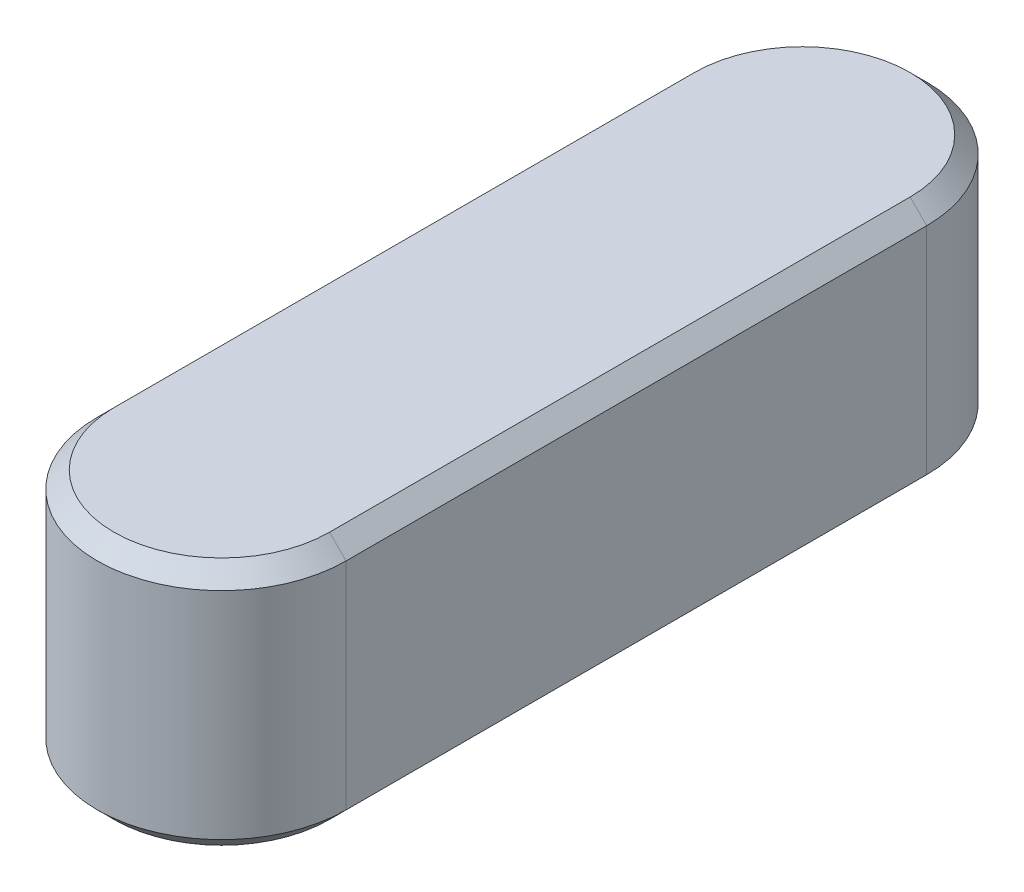
ISO-10303-21;
HEADER;
FILE_DESCRIPTION(('STEP AP214'),'2;1');
FILE_NAME('part.step','',(''),(''),'','','');
FILE_SCHEMA(('AUTOMOTIVE_DESIGN { 1 0 10303 214 1 1 1 1 }'));
ENDSEC;
DATA;
#1=APPLICATION_CONTEXT('core data for automotive mechanical design processes');
#2=APPLICATION_PROTOCOL_DEFINITION('international standard','automotive_design',2000,#1);
#3=PRODUCT_CONTEXT('',#1,'mechanical');
#4=PRODUCT('Part','Part','',(#3));
#5=PRODUCT_RELATED_PRODUCT_CATEGORY('part','',(#4));
#6=PRODUCT_DEFINITION_FORMATION('','',#4);
#7=PRODUCT_DEFINITION_CONTEXT('part definition',#1,'design');
#8=PRODUCT_DEFINITION('design','',#6,#7);
#9=PRODUCT_DEFINITION_SHAPE('','',#8);
#10=(LENGTH_UNIT() NAMED_UNIT(*) SI_UNIT(.MILLI.,.METRE.));
#11=(NAMED_UNIT(*) PLANE_ANGLE_UNIT() SI_UNIT($,.RADIAN.));
#12=(NAMED_UNIT(*) SI_UNIT($,.STERADIAN.) SOLID_ANGLE_UNIT());
#13=UNCERTAINTY_MEASURE_WITH_UNIT(LENGTH_MEASURE(1.E-05),#10,'distance_accuracy_value','');
#14=(GEOMETRIC_REPRESENTATION_CONTEXT(3) GLOBAL_UNCERTAINTY_ASSIGNED_CONTEXT((#13)) GLOBAL_UNIT_ASSIGNED_CONTEXT((#10,
#11,#12)) REPRESENTATION_CONTEXT('',''));
#15=CARTESIAN_POINT('',(0.,0.,0.));
#16=DIRECTION('',(0.,0.,1.));
#17=DIRECTION('',(1.,0.,0.));
#18=AXIS2_PLACEMENT_3D('',#15,#16,#17);
#19=CARTESIAN_POINT('',(-26.4948275862069,3.,-23.2833333333333));
#20=DIRECTION('',(0.,-1.,0.));
#21=DIRECTION('',(0.,0.,-1.));
#22=AXIS2_PLACEMENT_3D('',#19,#20,#21);
#23=CYLINDRICAL_SURFACE('',#22,1.5);
#24=DIRECTION('',(0.,-1.,0.));
#25=VECTOR('',#24,1.);
#26=CARTESIAN_POINT('',(-24.9948275862069,3.,-23.2833333333333));
#27=LINE('',#26,#25);
#28=CARTESIAN_POINT('',(-24.9948275862069,2.8,-23.2833333333333));
#29=VERTEX_POINT('',#28);
#30=CARTESIAN_POINT('',(-24.9948275862069,0.2,-23.2833333333333));
#31=VERTEX_POINT('',#30);
#32=EDGE_CURVE('E164',#29,#31,#27,.T.);
#33=ORIENTED_EDGE('',*,*,#32,.T.);
#34=CARTESIAN_POINT('',(-26.4948275862069,0.2,-23.2833333333333));
#35=DIRECTION('',(0.,1.,0.));
#36=DIRECTION('',(0.,0.,1.));
#37=AXIS2_PLACEMENT_3D('',#34,#35,#36);
#38=CIRCLE('',#37,1.5);
#39=CARTESIAN_POINT('',(-27.9948275862069,0.2,-23.2833333333333));
#40=VERTEX_POINT('',#39);
#41=EDGE_CURVE('E113',#31,#40,#38,.T.);
#42=ORIENTED_EDGE('',*,*,#41,.T.);
#43=DIRECTION('',(0.,-1.,0.));
#44=VECTOR('',#43,1.);
#45=CARTESIAN_POINT('',(-27.9948275862069,3.,-23.2833333333333));
#46=LINE('',#45,#44);
#47=CARTESIAN_POINT('',(-27.9948275862069,2.8,-23.2833333333333));
#48=VERTEX_POINT('',#47);
#49=EDGE_CURVE('E114',#48,#40,#46,.T.);
#50=ORIENTED_EDGE('',*,*,#49,.F.);
#51=CARTESIAN_POINT('',(-26.4948275862069,2.8,-23.2833333333333));
#52=DIRECTION('',(0.,1.,0.));
#53=DIRECTION('',(0.,0.,1.));
#54=AXIS2_PLACEMENT_3D('',#51,#52,#53);
#55=CIRCLE('',#54,1.5);
#56=EDGE_CURVE('E106',#48,#29,#55,.F.);
#57=ORIENTED_EDGE('',*,*,#56,.T.);
#58=EDGE_LOOP('',(#33,#42,#50,#57));
#59=FACE_BOUND('',#58,.T.);
#60=ADVANCED_FACE('F31',(#59),#23,.T.);
#61=CARTESIAN_POINT('',(-27.9948275862069,3.,-23.2833333333333));
#62=DIRECTION('',(1.,0.,0.));
#63=DIRECTION('',(0.,0.,-1.));
#64=AXIS2_PLACEMENT_3D('',#61,#62,#63);
#65=PLANE('',#64);
#66=ORIENTED_EDGE('',*,*,#49,.T.);
#67=DIRECTION('',(0.,0.,1.));
#68=VECTOR('',#67,1.);
#69=CARTESIAN_POINT('',(-27.9948275862069,0.2,-23.2833333333333));
#70=LINE('',#69,#68);
#71=CARTESIAN_POINT('',(-27.9948275862069,0.2,-16.2833333333333));
#72=VERTEX_POINT('',#71);
#73=EDGE_CURVE('E122',#40,#72,#70,.T.);
#74=ORIENTED_EDGE('',*,*,#73,.T.);
#75=DIRECTION('',(0.,-1.,0.));
#76=VECTOR('',#75,1.);
#77=CARTESIAN_POINT('',(-27.9948275862069,3.,-16.2833333333333));
#78=LINE('',#77,#76);
#79=CARTESIAN_POINT('',(-27.9948275862069,2.8,-16.2833333333333));
#80=VERTEX_POINT('',#79);
#81=EDGE_CURVE('E121',#80,#72,#78,.T.);
#82=ORIENTED_EDGE('',*,*,#81,.F.);
#83=DIRECTION('',(0.,0.,-1.));
#84=VECTOR('',#83,1.);
#85=CARTESIAN_POINT('',(-27.9948275862069,2.8,-23.2833333333333));
#86=LINE('',#85,#84);
#87=EDGE_CURVE('E101',#80,#48,#86,.T.);
#88=ORIENTED_EDGE('',*,*,#87,.T.);
#89=EDGE_LOOP('',(#66,#74,#82,#88));
#90=FACE_BOUND('',#89,.T.);
#91=ADVANCED_FACE('F119',(#90),#65,.F.);
#92=CARTESIAN_POINT('',(-26.4948275862069,3.,-16.2833333333333));
#93=DIRECTION('',(0.,-1.,0.));
#94=DIRECTION('',(0.,0.,-1.));
#95=AXIS2_PLACEMENT_3D('',#92,#93,#94);
#96=CYLINDRICAL_SURFACE('',#95,1.5);
#97=ORIENTED_EDGE('',*,*,#81,.T.);
#98=CARTESIAN_POINT('',(-26.4948275862069,0.2,-16.2833333333333));
#99=DIRECTION('',(0.,1.,0.));
#100=DIRECTION('',(0.,0.,1.));
#101=AXIS2_PLACEMENT_3D('',#98,#99,#100);
#102=CIRCLE('',#101,1.5);
#103=CARTESIAN_POINT('',(-24.9948275862069,0.2,-16.2833333333333));
#104=VERTEX_POINT('',#103);
#105=EDGE_CURVE('E148',#72,#104,#102,.T.);
#106=ORIENTED_EDGE('',*,*,#105,.T.);
#107=DIRECTION('',(0.,-1.,0.));
#108=VECTOR('',#107,1.);
#109=CARTESIAN_POINT('',(-24.9948275862069,3.,-16.2833333333333));
#110=LINE('',#109,#108);
#111=CARTESIAN_POINT('',(-24.9948275862069,2.8,-16.2833333333333));
#112=VERTEX_POINT('',#111);
#113=EDGE_CURVE('E128',#112,#104,#110,.T.);
#114=ORIENTED_EDGE('',*,*,#113,.F.);
#115=CARTESIAN_POINT('',(-26.4948275862069,2.8,-16.2833333333333));
#116=DIRECTION('',(0.,1.,0.));
#117=DIRECTION('',(0.,0.,1.));
#118=AXIS2_PLACEMENT_3D('',#115,#116,#117);
#119=CIRCLE('',#118,1.5);
#120=EDGE_CURVE('E146',#112,#80,#119,.F.);
#121=ORIENTED_EDGE('',*,*,#120,.T.);
#122=EDGE_LOOP('',(#97,#106,#114,#121));
#123=FACE_BOUND('',#122,.T.);
#124=ADVANCED_FACE('F185',(#123),#96,.T.);
#125=CARTESIAN_POINT('',(-24.9948275862069,3.,-23.2833333333333));
#126=DIRECTION('',(-1.,0.,0.));
#127=DIRECTION('',(0.,0.,1.));
#128=AXIS2_PLACEMENT_3D('',#125,#126,#127);
#129=PLANE('',#128);
#130=ORIENTED_EDGE('',*,*,#113,.T.);
#131=DIRECTION('',(0.,0.,-1.));
#132=VECTOR('',#131,1.);
#133=CARTESIAN_POINT('',(-24.9948275862069,0.2,-23.2833333333333));
#134=LINE('',#133,#132);
#135=EDGE_CURVE('E144',#104,#31,#134,.T.);
#136=ORIENTED_EDGE('',*,*,#135,.T.);
#137=ORIENTED_EDGE('',*,*,#32,.F.);
#138=DIRECTION('',(0.,0.,1.));
#139=VECTOR('',#138,1.);
#140=CARTESIAN_POINT('',(-24.9948275862069,2.8,-16.2833333333333));
#141=LINE('',#140,#139);
#142=EDGE_CURVE('E142',#29,#112,#141,.T.);
#143=ORIENTED_EDGE('',*,*,#142,.T.);
#144=EDGE_LOOP('',(#130,#136,#137,#143));
#145=FACE_BOUND('',#144,.T.);
#146=ADVANCED_FACE('F176',(#145),#129,.F.);
#147=CARTESIAN_POINT('',(-26.4948275862069,3.,-23.2833333333333));
#148=DIRECTION('',(0.,1.,0.));
#149=DIRECTION('',(0.,0.,1.));
#150=AXIS2_PLACEMENT_3D('',#147,#148,#149);
#151=PLANE('',#150);
#152=CARTESIAN_POINT('',(-26.4948275862069,3.,-23.2833333333333));
#153=DIRECTION('',(0.,1.,0.));
#154=DIRECTION('',(0.,0.,1.));
#155=AXIS2_PLACEMENT_3D('',#152,#153,#154);
#156=CIRCLE('',#155,1.3);
#157=CARTESIAN_POINT('',(-25.1948275862069,3.,-23.2833333333333));
#158=VERTEX_POINT('',#157);
#159=CARTESIAN_POINT('',(-27.7948275862069,3.,-23.2833333333333));
#160=VERTEX_POINT('',#159);
#161=EDGE_CURVE('E55',#158,#160,#156,.T.);
#162=ORIENTED_EDGE('',*,*,#161,.T.);
#163=DIRECTION('',(0.,0.,1.));
#164=VECTOR('',#163,1.);
#165=CARTESIAN_POINT('',(-27.7948275862069,3.,-16.2833333333333));
#166=LINE('',#165,#164);
#167=CARTESIAN_POINT('',(-27.7948275862069,3.,-16.2833333333333));
#168=VERTEX_POINT('',#167);
#169=EDGE_CURVE('E11',#160,#168,#166,.T.);
#170=ORIENTED_EDGE('',*,*,#169,.T.);
#171=CARTESIAN_POINT('',(-26.4948275862069,3.,-16.2833333333333));
#172=DIRECTION('',(0.,1.,0.));
#173=DIRECTION('',(0.,0.,1.));
#174=AXIS2_PLACEMENT_3D('',#171,#172,#173);
#175=CIRCLE('',#174,1.3);
#176=CARTESIAN_POINT('',(-25.1948275862069,3.,-16.2833333333333));
#177=VERTEX_POINT('',#176);
#178=EDGE_CURVE('E40',#168,#177,#175,.T.);
#179=ORIENTED_EDGE('',*,*,#178,.T.);
#180=DIRECTION('',(0.,0.,-1.));
#181=VECTOR('',#180,1.);
#182=CARTESIAN_POINT('',(-25.1948275862069,3.,-23.2833333333333));
#183=LINE('',#182,#181);
#184=EDGE_CURVE('E150',#177,#158,#183,.T.);
#185=ORIENTED_EDGE('',*,*,#184,.T.);
#186=EDGE_LOOP('',(#162,#170,#179,#185));
#187=FACE_BOUND('',#186,.T.);
#188=ADVANCED_FACE('F173',(#187),#151,.T.);
#189=CARTESIAN_POINT('',(-26.4948275862069,0.,-23.2833333333333));
#190=DIRECTION('',(0.,1.,0.));
#191=DIRECTION('',(0.,0.,1.));
#192=AXIS2_PLACEMENT_3D('',#189,#190,#191);
#193=PLANE('',#192);
#194=DIRECTION('',(0.,0.,-1.));
#195=VECTOR('',#194,1.);
#196=CARTESIAN_POINT('',(-27.7948275862069,0.,-23.2833333333333));
#197=LINE('',#196,#195);
#198=CARTESIAN_POINT('',(-27.7948275862069,0.,-16.2833333333333));
#199=VERTEX_POINT('',#198);
#200=CARTESIAN_POINT('',(-27.7948275862069,0.,-23.2833333333333));
#201=VERTEX_POINT('',#200);
#202=EDGE_CURVE('E137',#199,#201,#197,.T.);
#203=ORIENTED_EDGE('',*,*,#202,.T.);
#204=CARTESIAN_POINT('',(-26.4948275862069,0.,-23.2833333333333));
#205=DIRECTION('',(0.,1.,0.));
#206=DIRECTION('',(0.,0.,1.));
#207=AXIS2_PLACEMENT_3D('',#204,#205,#206);
#208=CIRCLE('',#207,1.3);
#209=CARTESIAN_POINT('',(-25.1948275862069,0.,-23.2833333333333));
#210=VERTEX_POINT('',#209);
#211=EDGE_CURVE('E123',#201,#210,#208,.F.);
#212=ORIENTED_EDGE('',*,*,#211,.T.);
#213=DIRECTION('',(0.,0.,1.));
#214=VECTOR('',#213,1.);
#215=CARTESIAN_POINT('',(-25.1948275862069,0.,-23.2833333333333));
#216=LINE('',#215,#214);
#217=CARTESIAN_POINT('',(-25.1948275862069,0.,-16.2833333333333));
#218=VERTEX_POINT('',#217);
#219=EDGE_CURVE('E135',#210,#218,#216,.T.);
#220=ORIENTED_EDGE('',*,*,#219,.T.);
#221=CARTESIAN_POINT('',(-26.4948275862069,0.,-16.2833333333333));
#222=DIRECTION('',(0.,1.,0.));
#223=DIRECTION('',(0.,0.,1.));
#224=AXIS2_PLACEMENT_3D('',#221,#222,#223);
#225=CIRCLE('',#224,1.3);
#226=EDGE_CURVE('E133',#218,#199,#225,.F.);
#227=ORIENTED_EDGE('',*,*,#226,.T.);
#228=EDGE_LOOP('',(#203,#212,#220,#227));
#229=FACE_BOUND('',#228,.T.);
#230=ADVANCED_FACE('F175',(#229),#193,.F.);
#231=CARTESIAN_POINT('',(-26.4948275862069,0.2,-16.2833333333333));
#232=DIRECTION('',(0.,1.,0.));
#233=DIRECTION('',(0.,0.,1.));
#234=AXIS2_PLACEMENT_3D('',#231,#232,#233);
#235=CONICAL_SURFACE('',#234,1.5,0.785398163397454);
#236=DIRECTION('',(-0.707106781186551,0.707106781186544,0.));
#237=VECTOR('',#236,1.);
#238=CARTESIAN_POINT('',(-27.7948275862069,0.,-16.2833333333333));
#239=LINE('',#238,#237);
#240=EDGE_CURVE('E158',#199,#72,#239,.T.);
#241=ORIENTED_EDGE('',*,*,#240,.F.);
#242=ORIENTED_EDGE('',*,*,#226,.F.);
#243=DIRECTION('',(-0.707106781186551,-0.707106781186544,0.));
#244=VECTOR('',#243,1.);
#245=CARTESIAN_POINT('',(-24.9948275862069,0.2,-16.2833333333333));
#246=LINE('',#245,#244);
#247=EDGE_CURVE('E161',#104,#218,#246,.T.);
#248=ORIENTED_EDGE('',*,*,#247,.F.);
#249=ORIENTED_EDGE('',*,*,#105,.F.);
#250=EDGE_LOOP('',(#241,#242,#248,#249));
#251=FACE_BOUND('',#250,.T.);
#252=ADVANCED_FACE('F182',(#251),#235,.T.);
#253=CARTESIAN_POINT('',(-24.9948275862069,0.2,-23.2833333333333));
#254=DIRECTION('',(-0.707106781186544,0.707106781186551,0.));
#255=DIRECTION('',(-0.707106781186551,-0.707106781186544,0.));
#256=AXIS2_PLACEMENT_3D('',#253,#254,#255);
#257=PLANE('',#256);
#258=ORIENTED_EDGE('',*,*,#247,.T.);
#259=ORIENTED_EDGE('',*,*,#219,.F.);
#260=DIRECTION('',(-0.707106781186551,-0.707106781186544,0.));
#261=VECTOR('',#260,1.);
#262=CARTESIAN_POINT('',(-24.9948275862069,0.2,-23.2833333333333));
#263=LINE('',#262,#261);
#264=EDGE_CURVE('E156',#31,#210,#263,.T.);
#265=ORIENTED_EDGE('',*,*,#264,.F.);
#266=ORIENTED_EDGE('',*,*,#135,.F.);
#267=EDGE_LOOP('',(#258,#259,#265,#266));
#268=FACE_BOUND('',#267,.T.);
#269=ADVANCED_FACE('F203',(#268),#257,.F.);
#270=CARTESIAN_POINT('',(-27.9948275862069,0.2,-23.2833333333333));
#271=DIRECTION('',(0.707106781186544,0.707106781186551,0.));
#272=DIRECTION('',(-0.707106781186551,0.707106781186544,0.));
#273=AXIS2_PLACEMENT_3D('',#270,#271,#272);
#274=PLANE('',#273);
#275=ORIENTED_EDGE('',*,*,#240,.T.);
#276=ORIENTED_EDGE('',*,*,#73,.F.);
#277=DIRECTION('',(-0.707106781186551,0.707106781186544,0.));
#278=VECTOR('',#277,1.);
#279=CARTESIAN_POINT('',(-27.7948275862069,0.,-23.2833333333333));
#280=LINE('',#279,#278);
#281=EDGE_CURVE('E154',#201,#40,#280,.T.);
#282=ORIENTED_EDGE('',*,*,#281,.F.);
#283=ORIENTED_EDGE('',*,*,#202,.F.);
#284=EDGE_LOOP('',(#275,#276,#282,#283));
#285=FACE_BOUND('',#284,.T.);
#286=ADVANCED_FACE('F199',(#285),#274,.F.);
#287=CARTESIAN_POINT('',(-26.4948275862069,0.2,-23.2833333333333));
#288=DIRECTION('',(0.,1.,0.));
#289=DIRECTION('',(0.,0.,1.));
#290=AXIS2_PLACEMENT_3D('',#287,#288,#289);
#291=CONICAL_SURFACE('',#290,1.5,0.785398163397454);
#292=ORIENTED_EDGE('',*,*,#264,.T.);
#293=ORIENTED_EDGE('',*,*,#211,.F.);
#294=ORIENTED_EDGE('',*,*,#281,.T.);
#295=ORIENTED_EDGE('',*,*,#41,.F.);
#296=EDGE_LOOP('',(#292,#293,#294,#295));
#297=FACE_BOUND('',#296,.T.);
#298=ADVANCED_FACE('F196',(#297),#291,.T.);
#299=CARTESIAN_POINT('',(-25.1948275862069,3.,-23.2833333333333));
#300=DIRECTION('',(0.707106781186548,0.707106781186548,0.));
#301=DIRECTION('',(-0.707106781186548,0.707106781186548,0.));
#302=AXIS2_PLACEMENT_3D('',#299,#300,#301);
#303=PLANE('',#302);
#304=DIRECTION('',(-0.707106781186548,0.707106781186548,0.));
#305=VECTOR('',#304,1.);
#306=CARTESIAN_POINT('',(-24.9948275862069,2.8,-16.2833333333333));
#307=LINE('',#306,#305);
#308=EDGE_CURVE('E103',#112,#177,#307,.T.);
#309=ORIENTED_EDGE('',*,*,#308,.F.);
#310=ORIENTED_EDGE('',*,*,#142,.F.);
#311=DIRECTION('',(0.707106781186548,-0.707106781186548,0.));
#312=VECTOR('',#311,1.);
#313=CARTESIAN_POINT('',(-25.1948275862069,3.,-23.2833333333333));
#314=LINE('',#313,#312);
#315=EDGE_CURVE('E35',#158,#29,#314,.T.);
#316=ORIENTED_EDGE('',*,*,#315,.F.);
#317=ORIENTED_EDGE('',*,*,#184,.F.);
#318=EDGE_LOOP('',(#309,#310,#316,#317));
#319=FACE_BOUND('',#318,.T.);
#320=ADVANCED_FACE('F33',(#319),#303,.T.);
#321=CARTESIAN_POINT('',(-26.4948275862069,3.,-23.2833333333333));
#322=DIRECTION('',(0.,-1.,0.));
#323=DIRECTION('',(0.,0.,-1.));
#324=AXIS2_PLACEMENT_3D('',#321,#322,#323);
#325=CONICAL_SURFACE('',#324,1.3,0.785398163397448);
#326=ORIENTED_EDGE('',*,*,#315,.T.);
#327=ORIENTED_EDGE('',*,*,#56,.F.);
#328=DIRECTION('',(-0.707106781186548,-0.707106781186548,0.));
#329=VECTOR('',#328,1.);
#330=CARTESIAN_POINT('',(-27.7948275862069,3.,-23.2833333333333));
#331=LINE('',#330,#329);
#332=EDGE_CURVE('E97',#160,#48,#331,.T.);
#333=ORIENTED_EDGE('',*,*,#332,.F.);
#334=ORIENTED_EDGE('',*,*,#161,.F.);
#335=EDGE_LOOP('',(#326,#327,#333,#334));
#336=FACE_BOUND('',#335,.T.);
#337=ADVANCED_FACE('F107',(#336),#325,.T.);
#338=CARTESIAN_POINT('',(-26.4948275862069,3.,-16.2833333333333));
#339=DIRECTION('',(0.,-1.,0.));
#340=DIRECTION('',(0.,0.,-1.));
#341=AXIS2_PLACEMENT_3D('',#338,#339,#340);
#342=CONICAL_SURFACE('',#341,1.3,0.785398163397448);
#343=ORIENTED_EDGE('',*,*,#308,.T.);
#344=ORIENTED_EDGE('',*,*,#178,.F.);
#345=DIRECTION('',(0.707106781186548,0.707106781186548,0.));
#346=VECTOR('',#345,1.);
#347=CARTESIAN_POINT('',(-27.9948275862069,2.8,-16.2833333333333));
#348=LINE('',#347,#346);
#349=EDGE_CURVE('E48',#80,#168,#348,.T.);
#350=ORIENTED_EDGE('',*,*,#349,.F.);
#351=ORIENTED_EDGE('',*,*,#120,.F.);
#352=EDGE_LOOP('',(#343,#344,#350,#351));
#353=FACE_BOUND('',#352,.T.);
#354=ADVANCED_FACE('F169',(#353),#342,.T.);
#355=CARTESIAN_POINT('',(-27.7948275862069,3.,-23.2833333333333));
#356=DIRECTION('',(-0.707106781186548,0.707106781186548,0.));
#357=DIRECTION('',(-0.707106781186548,-0.707106781186548,0.));
#358=AXIS2_PLACEMENT_3D('',#355,#356,#357);
#359=PLANE('',#358);
#360=ORIENTED_EDGE('',*,*,#332,.T.);
#361=ORIENTED_EDGE('',*,*,#87,.F.);
#362=ORIENTED_EDGE('',*,*,#349,.T.);
#363=ORIENTED_EDGE('',*,*,#169,.F.);
#364=EDGE_LOOP('',(#360,#361,#362,#363));
#365=FACE_BOUND('',#364,.T.);
#366=ADVANCED_FACE('F99',(#365),#359,.T.);
#367=CLOSED_SHELL('',(#60,#91,#124,#146,#188,#230,#252,#269,#286,#298,#320,#337,#354,#366));
#368=MANIFOLD_SOLID_BREP('B2',#367);
#369=ADVANCED_BREP_SHAPE_REPRESENTATION('',(#18,#368),#14);
#370=SHAPE_DEFINITION_REPRESENTATION(#9,#369);
ENDSEC;
END-ISO-10303-21;
